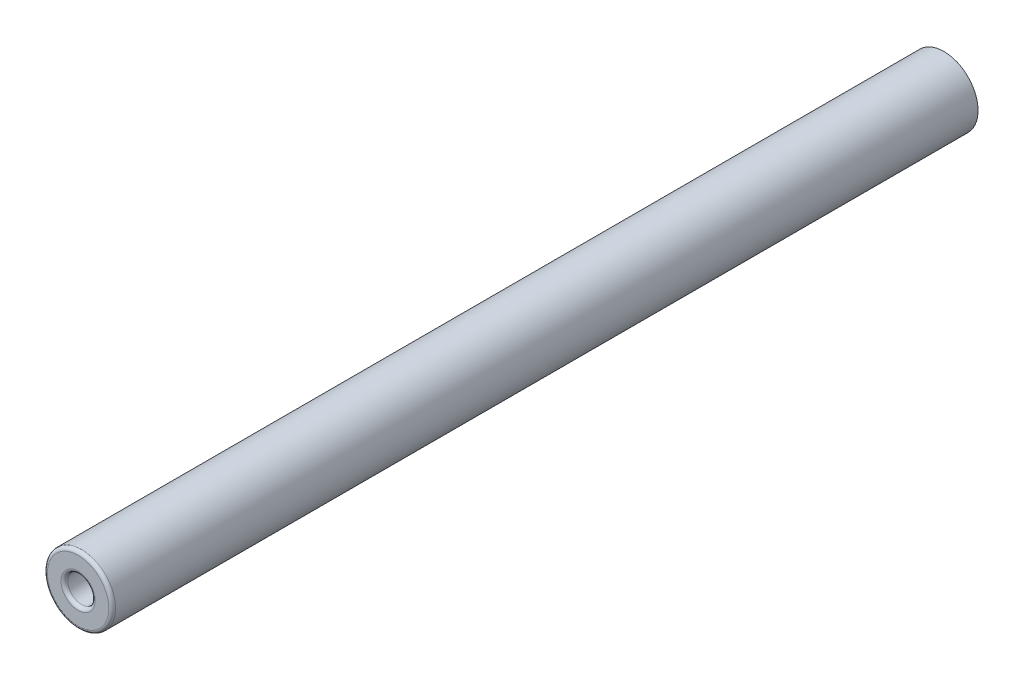
ISO-10303-21;
HEADER;
FILE_DESCRIPTION(('STEP AP214'),'2;1');
FILE_NAME('part.step','',(''),(''),'','','');
FILE_SCHEMA(('AUTOMOTIVE_DESIGN { 1 0 10303 214 1 1 1 1 }'));
ENDSEC;
DATA;
#1=APPLICATION_CONTEXT('core data for automotive mechanical design processes');
#2=APPLICATION_PROTOCOL_DEFINITION('international standard','automotive_design',2000,#1);
#3=PRODUCT_CONTEXT('',#1,'mechanical');
#4=PRODUCT('Part','Part','',(#3));
#5=PRODUCT_RELATED_PRODUCT_CATEGORY('part','',(#4));
#6=PRODUCT_DEFINITION_FORMATION('','',#4);
#7=PRODUCT_DEFINITION_CONTEXT('part definition',#1,'design');
#8=PRODUCT_DEFINITION('design','',#6,#7);
#9=PRODUCT_DEFINITION_SHAPE('','',#8);
#10=(LENGTH_UNIT() NAMED_UNIT(*) SI_UNIT(.MILLI.,.METRE.));
#11=(NAMED_UNIT(*) PLANE_ANGLE_UNIT() SI_UNIT($,.RADIAN.));
#12=(NAMED_UNIT(*) SI_UNIT($,.STERADIAN.) SOLID_ANGLE_UNIT());
#13=UNCERTAINTY_MEASURE_WITH_UNIT(LENGTH_MEASURE(1.E-05),#10,'distance_accuracy_value','');
#14=(GEOMETRIC_REPRESENTATION_CONTEXT(3) GLOBAL_UNCERTAINTY_ASSIGNED_CONTEXT((#13)) GLOBAL_UNIT_ASSIGNED_CONTEXT((#10,
#11,#12)) REPRESENTATION_CONTEXT('',''));
#15=CARTESIAN_POINT('',(0.,0.,0.));
#16=DIRECTION('',(0.,0.,1.));
#17=DIRECTION('',(1.,0.,0.));
#18=AXIS2_PLACEMENT_3D('',#15,#16,#17);
#19=CARTESIAN_POINT('',(0.,0.,68.));
#20=DIRECTION('',(0.,0.,-1.));
#21=DIRECTION('',(-1.,0.,0.));
#22=AXIS2_PLACEMENT_3D('',#19,#20,#21);
#23=CYLINDRICAL_SURFACE('',#22,2.5);
#24=CARTESIAN_POINT('',(0.,0.,67.75));
#25=DIRECTION('',(0.,0.,1.));
#26=DIRECTION('',(1.,0.,0.));
#27=AXIS2_PLACEMENT_3D('',#24,#25,#26);
#28=CIRCLE('',#27,2.5);
#29=CARTESIAN_POINT('',(2.5,0.,67.75));
#30=VERTEX_POINT('',#29);
#31=EDGE_CURVE('E23',#30,#30,#28,.T.);
#32=ORIENTED_EDGE('',*,*,#31,.F.);
#33=EDGE_LOOP('',(#32));
#34=FACE_BOUND('',#33,.T.);
#35=CARTESIAN_POINT('',(0.,0.,4.5));
#36=DIRECTION('',(0.,0.,-1.));
#37=DIRECTION('',(-1.,0.,0.));
#38=AXIS2_PLACEMENT_3D('',#35,#36,#37);
#39=CIRCLE('',#38,2.5);
#40=CARTESIAN_POINT('',(-2.5,0.,4.5));
#41=VERTEX_POINT('',#40);
#42=EDGE_CURVE('E10',#41,#41,#39,.T.);
#43=ORIENTED_EDGE('',*,*,#42,.F.);
#44=EDGE_LOOP('',(#43));
#45=FACE_BOUND('',#44,.T.);
#46=ADVANCED_FACE('F15',(#34,#45),#23,.T.);
#47=CARTESIAN_POINT('',(0.,0.,4.5));
#48=DIRECTION('',(0.,0.,-1.));
#49=DIRECTION('',(-1.,0.,0.));
#50=AXIS2_PLACEMENT_3D('',#47,#48,#49);
#51=PLANE('',#50);
#52=ORIENTED_EDGE('',*,*,#42,.T.);
#53=EDGE_LOOP('',(#52));
#54=FACE_BOUND('',#53,.T.);
#55=ADVANCED_FACE('F56',(#54),#51,.T.);
#56=CARTESIAN_POINT('',(0.,0.,67.75));
#57=DIRECTION('',(0.,0.,1.));
#58=DIRECTION('',(1.,0.,0.));
#59=AXIS2_PLACEMENT_3D('',#56,#57,#58);
#60=TOROIDAL_SURFACE('',#59,2.25,0.25);
#61=ORIENTED_EDGE('',*,*,#31,.T.);
#62=EDGE_LOOP('',(#61));
#63=FACE_BOUND('',#62,.T.);
#64=CARTESIAN_POINT('',(0.,0.,68.));
#65=DIRECTION('',(0.,0.,1.));
#66=DIRECTION('',(-1.,0.,0.));
#67=AXIS2_PLACEMENT_3D('',#64,#65,#66);
#68=CIRCLE('',#67,2.25);
#69=CARTESIAN_POINT('',(-2.25,0.,68.));
#70=VERTEX_POINT('',#69);
#71=EDGE_CURVE('E28',#70,#70,#68,.T.);
#72=ORIENTED_EDGE('',*,*,#71,.F.);
#73=EDGE_LOOP('',(#72));
#74=FACE_BOUND('',#73,.T.);
#75=ADVANCED_FACE('F62',(#63,#74),#60,.T.);
#76=CARTESIAN_POINT('',(0.,0.,68.));
#77=DIRECTION('',(0.,0.,1.));
#78=DIRECTION('',(1.,0.,0.));
#79=AXIS2_PLACEMENT_3D('',#76,#77,#78);
#80=PLANE('',#79);
#81=ORIENTED_EDGE('',*,*,#71,.T.);
#82=EDGE_LOOP('',(#81));
#83=FACE_BOUND('',#82,.T.);
#84=CARTESIAN_POINT('',(0.,0.,68.));
#85=DIRECTION('',(0.,0.,-1.));
#86=DIRECTION('',(-1.,0.,0.));
#87=AXIS2_PLACEMENT_3D('',#84,#85,#86);
#88=CIRCLE('',#87,1.25);
#89=CARTESIAN_POINT('',(-1.25,0.,68.));
#90=VERTEX_POINT('',#89);
#91=EDGE_CURVE('E33',#90,#90,#88,.T.);
#92=ORIENTED_EDGE('',*,*,#91,.T.);
#93=EDGE_LOOP('',(#92));
#94=FACE_BOUND('',#93,.T.);
#95=ADVANCED_FACE('F52',(#83,#94),#80,.T.);
#96=CARTESIAN_POINT('',(0.,0.,67.75));
#97=DIRECTION('',(0.,0.,1.));
#98=DIRECTION('',(1.,0.,0.));
#99=AXIS2_PLACEMENT_3D('',#96,#97,#98);
#100=TOROIDAL_SURFACE('',#99,1.25,0.25);
#101=ORIENTED_EDGE('',*,*,#91,.F.);
#102=EDGE_LOOP('',(#101));
#103=FACE_BOUND('',#102,.T.);
#104=CARTESIAN_POINT('',(0.,0.,67.75));
#105=DIRECTION('',(0.,0.,-1.));
#106=DIRECTION('',(1.,0.,0.));
#107=AXIS2_PLACEMENT_3D('',#104,#105,#106);
#108=CIRCLE('',#107,1.);
#109=CARTESIAN_POINT('',(1.,0.,67.75));
#110=VERTEX_POINT('',#109);
#111=EDGE_CURVE('E35',#110,#110,#108,.T.);
#112=ORIENTED_EDGE('',*,*,#111,.T.);
#113=EDGE_LOOP('',(#112));
#114=FACE_BOUND('',#113,.T.);
#115=ADVANCED_FACE('F46',(#103,#114),#100,.T.);
#116=CARTESIAN_POINT('',(0.,0.,58.));
#117=DIRECTION('',(0.,0.,1.));
#118=DIRECTION('',(1.,0.,0.));
#119=AXIS2_PLACEMENT_3D('',#116,#117,#118);
#120=CYLINDRICAL_SURFACE('',#119,1.);
#121=CARTESIAN_POINT('',(0.,0.,58.));
#122=DIRECTION('',(0.,0.,1.));
#123=DIRECTION('',(1.,0.,0.));
#124=AXIS2_PLACEMENT_3D('',#121,#122,#123);
#125=CIRCLE('',#124,1.);
#126=CARTESIAN_POINT('',(1.,0.,58.));
#127=VERTEX_POINT('',#126);
#128=EDGE_CURVE('E19',#127,#127,#125,.T.);
#129=ORIENTED_EDGE('',*,*,#128,.F.);
#130=EDGE_LOOP('',(#129));
#131=FACE_BOUND('',#130,.T.);
#132=ORIENTED_EDGE('',*,*,#111,.F.);
#133=EDGE_LOOP('',(#132));
#134=FACE_BOUND('',#133,.T.);
#135=ADVANCED_FACE('F43',(#131,#134),#120,.F.);
#136=CARTESIAN_POINT('',(0.,0.,58.));
#137=DIRECTION('',(0.,0.,1.));
#138=DIRECTION('',(1.,0.,0.));
#139=AXIS2_PLACEMENT_3D('',#136,#137,#138);
#140=PLANE('',#139);
#141=ORIENTED_EDGE('',*,*,#128,.T.);
#142=EDGE_LOOP('',(#141));
#143=FACE_BOUND('',#142,.T.);
#144=ADVANCED_FACE('F17',(#143),#140,.T.);
#145=CLOSED_SHELL('',(#46,#55,#75,#95,#115,#135,#144));
#146=MANIFOLD_SOLID_BREP('B1',#145);
#147=ADVANCED_BREP_SHAPE_REPRESENTATION('',(#18,#146),#14);
#148=SHAPE_DEFINITION_REPRESENTATION(#9,#147);
ENDSEC;
END-ISO-10303-21;
